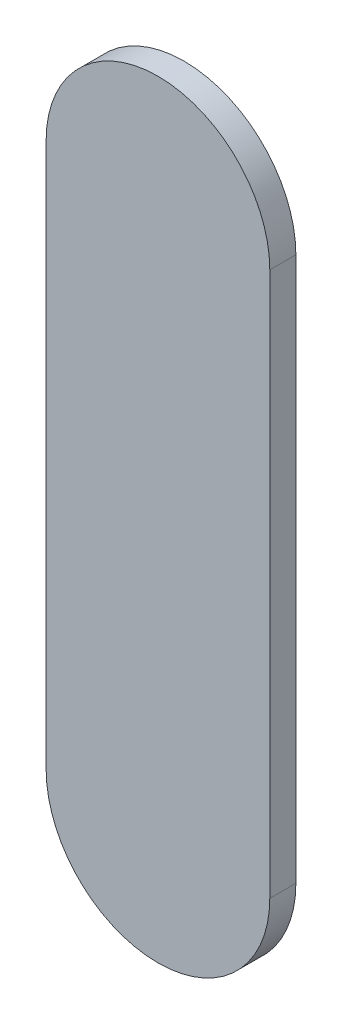
ISO-10303-21;
HEADER;
FILE_DESCRIPTION(('STEP AP214'),'2;1');
FILE_NAME('part.step','',(''),(''),'','','');
FILE_SCHEMA(('AUTOMOTIVE_DESIGN { 1 0 10303 214 1 1 1 1 }'));
ENDSEC;
DATA;
#1=APPLICATION_CONTEXT('core data for automotive mechanical design processes');
#2=APPLICATION_PROTOCOL_DEFINITION('international standard','automotive_design',2000,#1);
#3=PRODUCT_CONTEXT('',#1,'mechanical');
#4=PRODUCT('Part','Part','',(#3));
#5=PRODUCT_RELATED_PRODUCT_CATEGORY('part','',(#4));
#6=PRODUCT_DEFINITION_FORMATION('','',#4);
#7=PRODUCT_DEFINITION_CONTEXT('part definition',#1,'design');
#8=PRODUCT_DEFINITION('design','',#6,#7);
#9=PRODUCT_DEFINITION_SHAPE('','',#8);
#10=(LENGTH_UNIT() NAMED_UNIT(*) SI_UNIT(.MILLI.,.METRE.));
#11=(NAMED_UNIT(*) PLANE_ANGLE_UNIT() SI_UNIT($,.RADIAN.));
#12=(NAMED_UNIT(*) SI_UNIT($,.STERADIAN.) SOLID_ANGLE_UNIT());
#13=UNCERTAINTY_MEASURE_WITH_UNIT(LENGTH_MEASURE(1.E-05),#10,'distance_accuracy_value','');
#14=(GEOMETRIC_REPRESENTATION_CONTEXT(3) GLOBAL_UNCERTAINTY_ASSIGNED_CONTEXT((#13)) GLOBAL_UNIT_ASSIGNED_CONTEXT((#10,
#11,#12)) REPRESENTATION_CONTEXT('',''));
#15=CARTESIAN_POINT('',(0.,0.,0.));
#16=DIRECTION('',(0.,0.,1.));
#17=DIRECTION('',(1.,0.,0.));
#18=AXIS2_PLACEMENT_3D('',#15,#16,#17);
#19=CARTESIAN_POINT('',(116.141,-63.379,1.635));
#20=DIRECTION('',(0.,0.,1.));
#21=DIRECTION('',(1.,0.,0.));
#22=AXIS2_PLACEMENT_3D('',#19,#20,#21);
#23=PLANE('',#22);
#24=DIRECTION('',(0.,-1.,0.));
#25=VECTOR('',#24,1.);
#26=CARTESIAN_POINT('',(116.141,-63.379,1.635));
#27=LINE('',#26,#25);
#28=CARTESIAN_POINT('',(116.141,-63.379,1.635));
#29=VERTEX_POINT('',#28);
#30=CARTESIAN_POINT('',(116.141,-64.109,1.635));
#31=VERTEX_POINT('',#30);
#32=EDGE_CURVE('E83',#29,#31,#27,.T.);
#33=ORIENTED_EDGE('',*,*,#32,.T.);
#34=CARTESIAN_POINT('',(116.291,-64.109,1.635));
#35=DIRECTION('',(0.,0.,1.));
#36=DIRECTION('',(-1.,0.,0.));
#37=AXIS2_PLACEMENT_3D('',#34,#35,#36);
#38=CIRCLE('',#37,0.15);
#39=CARTESIAN_POINT('',(116.441,-64.109,1.635));
#40=VERTEX_POINT('',#39);
#41=EDGE_CURVE('E106',#31,#40,#38,.T.);
#42=ORIENTED_EDGE('',*,*,#41,.T.);
#43=DIRECTION('',(0.,1.,0.));
#44=VECTOR('',#43,1.);
#45=CARTESIAN_POINT('',(116.441,-64.109,1.635));
#46=LINE('',#45,#44);
#47=CARTESIAN_POINT('',(116.441,-63.379,1.635));
#48=VERTEX_POINT('',#47);
#49=EDGE_CURVE('E76',#40,#48,#46,.T.);
#50=ORIENTED_EDGE('',*,*,#49,.T.);
#51=CARTESIAN_POINT('',(116.291,-63.379,1.635));
#52=DIRECTION('',(0.,0.,1.));
#53=DIRECTION('',(1.,0.,0.));
#54=AXIS2_PLACEMENT_3D('',#51,#52,#53);
#55=CIRCLE('',#54,0.15);
#56=EDGE_CURVE('E11',#48,#29,#55,.T.);
#57=ORIENTED_EDGE('',*,*,#56,.T.);
#58=EDGE_LOOP('',(#33,#42,#50,#57));
#59=FACE_BOUND('',#58,.T.);
#60=ADVANCED_FACE('F17',(#59),#23,.T.);
#61=CARTESIAN_POINT('',(116.141,-63.379,1.6));
#62=DIRECTION('',(0.,0.,1.));
#63=DIRECTION('',(1.,0.,0.));
#64=AXIS2_PLACEMENT_3D('',#61,#62,#63);
#65=PLANE('',#64);
#66=CARTESIAN_POINT('',(116.291,-63.379,1.6));
#67=DIRECTION('',(0.,0.,1.));
#68=DIRECTION('',(1.,0.,0.));
#69=AXIS2_PLACEMENT_3D('',#66,#67,#68);
#70=CIRCLE('',#69,0.15);
#71=CARTESIAN_POINT('',(116.441,-63.379,1.6));
#72=VERTEX_POINT('',#71);
#73=CARTESIAN_POINT('',(116.141,-63.379,1.6));
#74=VERTEX_POINT('',#73);
#75=EDGE_CURVE('E21',#72,#74,#70,.T.);
#76=ORIENTED_EDGE('',*,*,#75,.F.);
#77=DIRECTION('',(0.,1.,0.));
#78=VECTOR('',#77,1.);
#79=CARTESIAN_POINT('',(116.441,-64.109,1.6));
#80=LINE('',#79,#78);
#81=CARTESIAN_POINT('',(116.441,-64.109,1.6));
#82=VERTEX_POINT('',#81);
#83=EDGE_CURVE('E110',#82,#72,#80,.T.);
#84=ORIENTED_EDGE('',*,*,#83,.F.);
#85=CARTESIAN_POINT('',(116.291,-64.109,1.6));
#86=DIRECTION('',(0.,0.,1.));
#87=DIRECTION('',(-1.,0.,0.));
#88=AXIS2_PLACEMENT_3D('',#85,#86,#87);
#89=CIRCLE('',#88,0.15);
#90=CARTESIAN_POINT('',(116.141,-64.109,1.6));
#91=VERTEX_POINT('',#90);
#92=EDGE_CURVE('E85',#91,#82,#89,.T.);
#93=ORIENTED_EDGE('',*,*,#92,.F.);
#94=DIRECTION('',(0.,-1.,0.));
#95=VECTOR('',#94,1.);
#96=CARTESIAN_POINT('',(116.141,-63.379,1.6));
#97=LINE('',#96,#95);
#98=EDGE_CURVE('E81',#74,#91,#97,.T.);
#99=ORIENTED_EDGE('',*,*,#98,.F.);
#100=EDGE_LOOP('',(#76,#84,#93,#99));
#101=FACE_BOUND('',#100,.T.);
#102=ADVANCED_FACE('F19',(#101),#65,.F.);
#103=CARTESIAN_POINT('',(116.291,-63.379,1.6));
#104=DIRECTION('',(0.,0.,-1.));
#105=DIRECTION('',(1.,0.,0.));
#106=AXIS2_PLACEMENT_3D('',#103,#104,#105);
#107=CYLINDRICAL_SURFACE('',#106,0.15);
#108=ORIENTED_EDGE('',*,*,#75,.T.);
#109=DIRECTION('',(0.,0.,1.));
#110=VECTOR('',#109,1.);
#111=CARTESIAN_POINT('',(116.141,-63.379,1.6));
#112=LINE('',#111,#110);
#113=EDGE_CURVE('E70',#74,#29,#112,.T.);
#114=ORIENTED_EDGE('',*,*,#113,.T.);
#115=ORIENTED_EDGE('',*,*,#56,.F.);
#116=DIRECTION('',(0.,0.,1.));
#117=VECTOR('',#116,1.);
#118=CARTESIAN_POINT('',(116.441,-63.379,1.6));
#119=LINE('',#118,#117);
#120=EDGE_CURVE('E73',#72,#48,#119,.T.);
#121=ORIENTED_EDGE('',*,*,#120,.F.);
#122=EDGE_LOOP('',(#108,#114,#115,#121));
#123=FACE_BOUND('',#122,.T.);
#124=ADVANCED_FACE('F69',(#123),#107,.T.);
#125=CARTESIAN_POINT('',(116.441,-64.109,1.6));
#126=DIRECTION('',(-1.,0.,0.));
#127=DIRECTION('',(0.,0.,1.));
#128=AXIS2_PLACEMENT_3D('',#125,#126,#127);
#129=PLANE('',#128);
#130=ORIENTED_EDGE('',*,*,#83,.T.);
#131=ORIENTED_EDGE('',*,*,#120,.T.);
#132=ORIENTED_EDGE('',*,*,#49,.F.);
#133=DIRECTION('',(0.,0.,1.));
#134=VECTOR('',#133,1.);
#135=CARTESIAN_POINT('',(116.441,-64.109,1.6));
#136=LINE('',#135,#134);
#137=EDGE_CURVE('E100',#82,#40,#136,.T.);
#138=ORIENTED_EDGE('',*,*,#137,.F.);
#139=EDGE_LOOP('',(#130,#131,#132,#138));
#140=FACE_BOUND('',#139,.T.);
#141=ADVANCED_FACE('F120',(#140),#129,.F.);
#142=CARTESIAN_POINT('',(116.291,-64.109,1.6));
#143=DIRECTION('',(0.,0.,-1.));
#144=DIRECTION('',(-1.,0.,0.));
#145=AXIS2_PLACEMENT_3D('',#142,#143,#144);
#146=CYLINDRICAL_SURFACE('',#145,0.15);
#147=ORIENTED_EDGE('',*,*,#92,.T.);
#148=ORIENTED_EDGE('',*,*,#137,.T.);
#149=ORIENTED_EDGE('',*,*,#41,.F.);
#150=DIRECTION('',(0.,0.,1.));
#151=VECTOR('',#150,1.);
#152=CARTESIAN_POINT('',(116.141,-64.109,1.6));
#153=LINE('',#152,#151);
#154=EDGE_CURVE('E90',#91,#31,#153,.T.);
#155=ORIENTED_EDGE('',*,*,#154,.F.);
#156=EDGE_LOOP('',(#147,#148,#149,#155));
#157=FACE_BOUND('',#156,.T.);
#158=ADVANCED_FACE('F122',(#157),#146,.T.);
#159=CARTESIAN_POINT('',(116.141,-63.379,1.6));
#160=DIRECTION('',(1.,0.,0.));
#161=DIRECTION('',(0.,1.,0.));
#162=AXIS2_PLACEMENT_3D('',#159,#160,#161);
#163=PLANE('',#162);
#164=ORIENTED_EDGE('',*,*,#98,.T.);
#165=ORIENTED_EDGE('',*,*,#154,.T.);
#166=ORIENTED_EDGE('',*,*,#32,.F.);
#167=ORIENTED_EDGE('',*,*,#113,.F.);
#168=EDGE_LOOP('',(#164,#165,#166,#167));
#169=FACE_BOUND('',#168,.T.);
#170=ADVANCED_FACE('F79',(#169),#163,.F.);
#171=CLOSED_SHELL('',(#60,#102,#124,#141,#158,#170));
#172=MANIFOLD_SOLID_BREP('B1',#171);
#173=ADVANCED_BREP_SHAPE_REPRESENTATION('',(#18,#172),#14);
#174=SHAPE_DEFINITION_REPRESENTATION(#9,#173);
ENDSEC;
END-ISO-10303-21;
